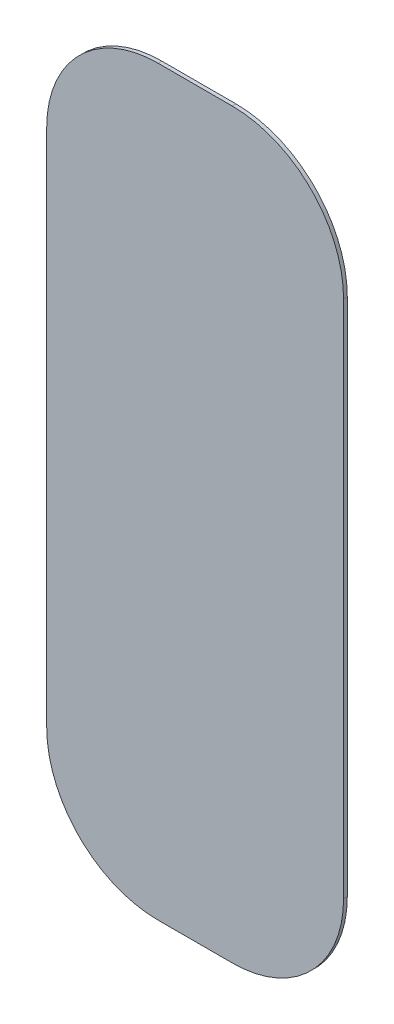
ISO-10303-21;
HEADER;
FILE_DESCRIPTION(('STEP AP214'),'2;1');
FILE_NAME('part.step','',(''),(''),'','','');
FILE_SCHEMA(('AUTOMOTIVE_DESIGN { 1 0 10303 214 1 1 1 1 }'));
ENDSEC;
DATA;
#1=APPLICATION_CONTEXT('core data for automotive mechanical design processes');
#2=APPLICATION_PROTOCOL_DEFINITION('international standard','automotive_design',2000,#1);
#3=PRODUCT_CONTEXT('',#1,'mechanical');
#4=PRODUCT('Part','Part','',(#3));
#5=PRODUCT_RELATED_PRODUCT_CATEGORY('part','',(#4));
#6=PRODUCT_DEFINITION_FORMATION('','',#4);
#7=PRODUCT_DEFINITION_CONTEXT('part definition',#1,'design');
#8=PRODUCT_DEFINITION('design','',#6,#7);
#9=PRODUCT_DEFINITION_SHAPE('','',#8);
#10=(LENGTH_UNIT() NAMED_UNIT(*) SI_UNIT(.MILLI.,.METRE.));
#11=(NAMED_UNIT(*) PLANE_ANGLE_UNIT() SI_UNIT($,.RADIAN.));
#12=(NAMED_UNIT(*) SI_UNIT($,.STERADIAN.) SOLID_ANGLE_UNIT());
#13=UNCERTAINTY_MEASURE_WITH_UNIT(LENGTH_MEASURE(1.E-05),#10,'distance_accuracy_value','');
#14=(GEOMETRIC_REPRESENTATION_CONTEXT(3) GLOBAL_UNCERTAINTY_ASSIGNED_CONTEXT((#13)) GLOBAL_UNIT_ASSIGNED_CONTEXT((#10,
#11,#12)) REPRESENTATION_CONTEXT('',''));
#15=CARTESIAN_POINT('',(0.,0.,0.));
#16=DIRECTION('',(0.,0.,1.));
#17=DIRECTION('',(1.,0.,0.));
#18=AXIS2_PLACEMENT_3D('',#15,#16,#17);
#19=CARTESIAN_POINT('',(-20.,140.,2.));
#20=DIRECTION('',(0.,0.,1.));
#21=DIRECTION('',(1.,0.,0.));
#22=AXIS2_PLACEMENT_3D('',#19,#20,#21);
#23=CYLINDRICAL_SURFACE('',#22,60.);
#24=DIRECTION('',(0.,0.,1.));
#25=VECTOR('',#24,1.);
#26=CARTESIAN_POINT('',(-20.,200.,2.));
#27=LINE('',#26,#25);
#28=CARTESIAN_POINT('',(-20.,200.,0.));
#29=VERTEX_POINT('',#28);
#30=CARTESIAN_POINT('',(-20.,200.,2.));
#31=VERTEX_POINT('',#30);
#32=EDGE_CURVE('E11',#29,#31,#27,.T.);
#33=ORIENTED_EDGE('',*,*,#32,.F.);
#34=CARTESIAN_POINT('',(-20.,140.,0.));
#35=DIRECTION('',(0.,0.,1.));
#36=DIRECTION('',(1.,0.,0.));
#37=AXIS2_PLACEMENT_3D('',#34,#35,#36);
#38=CIRCLE('',#37,60.);
#39=CARTESIAN_POINT('',(-80.,140.,0.));
#40=VERTEX_POINT('',#39);
#41=EDGE_CURVE('E104',#29,#40,#38,.T.);
#42=ORIENTED_EDGE('',*,*,#41,.T.);
#43=DIRECTION('',(0.,0.,1.));
#44=VECTOR('',#43,1.);
#45=CARTESIAN_POINT('',(-80.,140.,2.));
#46=LINE('',#45,#44);
#47=CARTESIAN_POINT('',(-80.,140.,2.));
#48=VERTEX_POINT('',#47);
#49=EDGE_CURVE('E47',#40,#48,#46,.T.);
#50=ORIENTED_EDGE('',*,*,#49,.T.);
#51=CARTESIAN_POINT('',(-20.,140.,2.));
#52=DIRECTION('',(0.,0.,1.));
#53=DIRECTION('',(-1.,0.,0.));
#54=AXIS2_PLACEMENT_3D('',#51,#52,#53);
#55=CIRCLE('',#54,60.);
#56=EDGE_CURVE('E143',#31,#48,#55,.T.);
#57=ORIENTED_EDGE('',*,*,#56,.F.);
#58=EDGE_LOOP('',(#33,#42,#50,#57));
#59=FACE_BOUND('',#58,.T.);
#60=ADVANCED_FACE('F37',(#59),#23,.T.);
#61=CARTESIAN_POINT('',(-79.9999999999999,-140.,2.));
#62=DIRECTION('',(-1.,0.,0.));
#63=DIRECTION('',(0.,-1.,0.));
#64=AXIS2_PLACEMENT_3D('',#61,#62,#63);
#65=PLANE('',#64);
#66=ORIENTED_EDGE('',*,*,#49,.F.);
#67=DIRECTION('',(0.,1.,0.));
#68=VECTOR('',#67,1.);
#69=CARTESIAN_POINT('',(-80.,140.,0.));
#70=LINE('',#69,#68);
#71=CARTESIAN_POINT('',(-79.9999999999999,-140.,0.));
#72=VERTEX_POINT('',#71);
#73=EDGE_CURVE('E123',#40,#72,#70,.F.);
#74=ORIENTED_EDGE('',*,*,#73,.T.);
#75=DIRECTION('',(0.,0.,1.));
#76=VECTOR('',#75,1.);
#77=CARTESIAN_POINT('',(-79.9999999999999,-140.,2.));
#78=LINE('',#77,#76);
#79=CARTESIAN_POINT('',(-79.9999999999999,-140.,2.));
#80=VERTEX_POINT('',#79);
#81=EDGE_CURVE('E136',#72,#80,#78,.T.);
#82=ORIENTED_EDGE('',*,*,#81,.T.);
#83=DIRECTION('',(0.,-1.,0.));
#84=VECTOR('',#83,1.);
#85=CARTESIAN_POINT('',(-79.9999999999999,-140.,2.));
#86=LINE('',#85,#84);
#87=EDGE_CURVE('E152',#48,#80,#86,.T.);
#88=ORIENTED_EDGE('',*,*,#87,.F.);
#89=EDGE_LOOP('',(#66,#74,#82,#88));
#90=FACE_BOUND('',#89,.T.);
#91=ADVANCED_FACE('F155',(#90),#65,.T.);
#92=CARTESIAN_POINT('',(-19.9999999999999,-140.,2.));
#93=DIRECTION('',(0.,0.,1.));
#94=DIRECTION('',(1.,0.,0.));
#95=AXIS2_PLACEMENT_3D('',#92,#93,#94);
#96=CYLINDRICAL_SURFACE('',#95,60.);
#97=ORIENTED_EDGE('',*,*,#81,.F.);
#98=CARTESIAN_POINT('',(-19.9999999999999,-140.,0.));
#99=DIRECTION('',(0.,0.,1.));
#100=DIRECTION('',(1.,0.,0.));
#101=AXIS2_PLACEMENT_3D('',#98,#99,#100);
#102=CIRCLE('',#101,60.);
#103=CARTESIAN_POINT('',(-19.9999999999999,-200.,0.));
#104=VERTEX_POINT('',#103);
#105=EDGE_CURVE('E120',#72,#104,#102,.T.);
#106=ORIENTED_EDGE('',*,*,#105,.T.);
#107=DIRECTION('',(0.,0.,1.));
#108=VECTOR('',#107,1.);
#109=CARTESIAN_POINT('',(-19.9999999999999,-200.,2.));
#110=LINE('',#109,#108);
#111=CARTESIAN_POINT('',(-19.9999999999999,-200.,2.));
#112=VERTEX_POINT('',#111);
#113=EDGE_CURVE('E133',#104,#112,#110,.T.);
#114=ORIENTED_EDGE('',*,*,#113,.T.);
#115=CARTESIAN_POINT('',(-19.9999999999999,-140.,2.));
#116=DIRECTION('',(0.,0.,1.));
#117=DIRECTION('',(1.,0.,0.));
#118=AXIS2_PLACEMENT_3D('',#115,#116,#117);
#119=CIRCLE('',#118,60.);
#120=EDGE_CURVE('E156',#80,#112,#119,.T.);
#121=ORIENTED_EDGE('',*,*,#120,.F.);
#122=EDGE_LOOP('',(#97,#106,#114,#121));
#123=FACE_BOUND('',#122,.T.);
#124=ADVANCED_FACE('F178',(#123),#96,.T.);
#125=CARTESIAN_POINT('',(20.,-200.,2.));
#126=DIRECTION('',(0.,-1.,0.));
#127=DIRECTION('',(1.,0.,0.));
#128=AXIS2_PLACEMENT_3D('',#125,#126,#127);
#129=PLANE('',#128);
#130=ORIENTED_EDGE('',*,*,#113,.F.);
#131=DIRECTION('',(1.,0.,0.));
#132=VECTOR('',#131,1.);
#133=CARTESIAN_POINT('',(20.,-200.,0.));
#134=LINE('',#133,#132);
#135=CARTESIAN_POINT('',(20.,-200.,0.));
#136=VERTEX_POINT('',#135);
#137=EDGE_CURVE('E117',#104,#136,#134,.T.);
#138=ORIENTED_EDGE('',*,*,#137,.T.);
#139=DIRECTION('',(0.,0.,1.));
#140=VECTOR('',#139,1.);
#141=CARTESIAN_POINT('',(20.,-200.,2.));
#142=LINE('',#141,#140);
#143=CARTESIAN_POINT('',(20.,-200.,2.));
#144=VERTEX_POINT('',#143);
#145=EDGE_CURVE('E130',#136,#144,#142,.T.);
#146=ORIENTED_EDGE('',*,*,#145,.T.);
#147=DIRECTION('',(1.,0.,0.));
#148=VECTOR('',#147,1.);
#149=CARTESIAN_POINT('',(20.,-200.,2.));
#150=LINE('',#149,#148);
#151=EDGE_CURVE('E158',#112,#144,#150,.T.);
#152=ORIENTED_EDGE('',*,*,#151,.F.);
#153=EDGE_LOOP('',(#130,#138,#146,#152));
#154=FACE_BOUND('',#153,.T.);
#155=ADVANCED_FACE('F174',(#154),#129,.T.);
#156=CARTESIAN_POINT('',(20.,-140.,2.));
#157=DIRECTION('',(0.,0.,1.));
#158=DIRECTION('',(1.,0.,0.));
#159=AXIS2_PLACEMENT_3D('',#156,#157,#158);
#160=CYLINDRICAL_SURFACE('',#159,60.);
#161=ORIENTED_EDGE('',*,*,#145,.F.);
#162=CARTESIAN_POINT('',(20.,-140.,0.));
#163=DIRECTION('',(0.,0.,1.));
#164=DIRECTION('',(1.,0.,0.));
#165=AXIS2_PLACEMENT_3D('',#162,#163,#164);
#166=CIRCLE('',#165,60.);
#167=CARTESIAN_POINT('',(80.,-140.,0.));
#168=VERTEX_POINT('',#167);
#169=EDGE_CURVE('E114',#136,#168,#166,.T.);
#170=ORIENTED_EDGE('',*,*,#169,.T.);
#171=DIRECTION('',(0.,0.,1.));
#172=VECTOR('',#171,1.);
#173=CARTESIAN_POINT('',(80.,-140.,2.));
#174=LINE('',#173,#172);
#175=CARTESIAN_POINT('',(80.,-140.,2.));
#176=VERTEX_POINT('',#175);
#177=EDGE_CURVE('E128',#168,#176,#174,.T.);
#178=ORIENTED_EDGE('',*,*,#177,.T.);
#179=CARTESIAN_POINT('',(20.,-140.,2.));
#180=DIRECTION('',(0.,0.,1.));
#181=DIRECTION('',(-1.,0.,0.));
#182=AXIS2_PLACEMENT_3D('',#179,#180,#181);
#183=CIRCLE('',#182,60.);
#184=EDGE_CURVE('E163',#144,#176,#183,.T.);
#185=ORIENTED_EDGE('',*,*,#184,.F.);
#186=EDGE_LOOP('',(#161,#170,#178,#185));
#187=FACE_BOUND('',#186,.T.);
#188=ADVANCED_FACE('F170',(#187),#160,.T.);
#189=CARTESIAN_POINT('',(80.,-140.,2.));
#190=DIRECTION('',(1.,0.,0.));
#191=DIRECTION('',(0.,1.,0.));
#192=AXIS2_PLACEMENT_3D('',#189,#190,#191);
#193=PLANE('',#192);
#194=ORIENTED_EDGE('',*,*,#177,.F.);
#195=DIRECTION('',(0.,1.,0.));
#196=VECTOR('',#195,1.);
#197=CARTESIAN_POINT('',(80.,140.,0.));
#198=LINE('',#197,#196);
#199=CARTESIAN_POINT('',(80.,140.,0.));
#200=VERTEX_POINT('',#199);
#201=EDGE_CURVE('E111',#168,#200,#198,.T.);
#202=ORIENTED_EDGE('',*,*,#201,.T.);
#203=DIRECTION('',(0.,0.,1.));
#204=VECTOR('',#203,1.);
#205=CARTESIAN_POINT('',(80.,140.,2.));
#206=LINE('',#205,#204);
#207=CARTESIAN_POINT('',(80.,140.,2.));
#208=VERTEX_POINT('',#207);
#209=EDGE_CURVE('E55',#200,#208,#206,.T.);
#210=ORIENTED_EDGE('',*,*,#209,.T.);
#211=DIRECTION('',(0.,1.,0.));
#212=VECTOR('',#211,1.);
#213=CARTESIAN_POINT('',(80.,-140.,2.));
#214=LINE('',#213,#212);
#215=EDGE_CURVE('E97',#176,#208,#214,.T.);
#216=ORIENTED_EDGE('',*,*,#215,.F.);
#217=EDGE_LOOP('',(#194,#202,#210,#216));
#218=FACE_BOUND('',#217,.T.);
#219=ADVANCED_FACE('F167',(#218),#193,.T.);
#220=CARTESIAN_POINT('',(20.,140.,2.));
#221=DIRECTION('',(0.,0.,1.));
#222=DIRECTION('',(1.,0.,0.));
#223=AXIS2_PLACEMENT_3D('',#220,#221,#222);
#224=CYLINDRICAL_SURFACE('',#223,60.);
#225=ORIENTED_EDGE('',*,*,#209,.F.);
#226=CARTESIAN_POINT('',(20.,140.,0.));
#227=DIRECTION('',(0.,0.,1.));
#228=DIRECTION('',(1.,0.,0.));
#229=AXIS2_PLACEMENT_3D('',#226,#227,#228);
#230=CIRCLE('',#229,60.);
#231=CARTESIAN_POINT('',(20.,200.,0.));
#232=VERTEX_POINT('',#231);
#233=EDGE_CURVE('E102',#200,#232,#230,.T.);
#234=ORIENTED_EDGE('',*,*,#233,.T.);
#235=DIRECTION('',(0.,0.,1.));
#236=VECTOR('',#235,1.);
#237=CARTESIAN_POINT('',(20.,200.,2.));
#238=LINE('',#237,#236);
#239=CARTESIAN_POINT('',(20.,200.,2.));
#240=VERTEX_POINT('',#239);
#241=EDGE_CURVE('E41',#232,#240,#238,.T.);
#242=ORIENTED_EDGE('',*,*,#241,.T.);
#243=CARTESIAN_POINT('',(20.,140.,2.));
#244=DIRECTION('',(0.,0.,1.));
#245=DIRECTION('',(1.,0.,0.));
#246=AXIS2_PLACEMENT_3D('',#243,#244,#245);
#247=CIRCLE('',#246,60.);
#248=EDGE_CURVE('E113',#208,#240,#247,.T.);
#249=ORIENTED_EDGE('',*,*,#248,.F.);
#250=EDGE_LOOP('',(#225,#234,#242,#249));
#251=FACE_BOUND('',#250,.T.);
#252=ADVANCED_FACE('F106',(#251),#224,.T.);
#253=CARTESIAN_POINT('',(20.,200.,2.));
#254=DIRECTION('',(0.,1.,0.));
#255=DIRECTION('',(-1.,0.,0.));
#256=AXIS2_PLACEMENT_3D('',#253,#254,#255);
#257=PLANE('',#256);
#258=DIRECTION('',(1.,0.,0.));
#259=VECTOR('',#258,1.);
#260=CARTESIAN_POINT('',(20.,200.,0.));
#261=LINE('',#260,#259);
#262=EDGE_CURVE('E91',#232,#29,#261,.F.);
#263=ORIENTED_EDGE('',*,*,#262,.T.);
#264=ORIENTED_EDGE('',*,*,#32,.T.);
#265=DIRECTION('',(-1.,0.,0.));
#266=VECTOR('',#265,1.);
#267=CARTESIAN_POINT('',(20.,200.,2.));
#268=LINE('',#267,#266);
#269=EDGE_CURVE('E93',#240,#31,#268,.T.);
#270=ORIENTED_EDGE('',*,*,#269,.F.);
#271=ORIENTED_EDGE('',*,*,#241,.F.);
#272=EDGE_LOOP('',(#263,#264,#270,#271));
#273=FACE_BOUND('',#272,.T.);
#274=ADVANCED_FACE('F39',(#273),#257,.T.);
#275=CARTESIAN_POINT('',(20.,140.,2.));
#276=DIRECTION('',(0.,0.,1.));
#277=DIRECTION('',(1.,0.,0.));
#278=AXIS2_PLACEMENT_3D('',#275,#276,#277);
#279=PLANE('',#278);
#280=ORIENTED_EDGE('',*,*,#248,.T.);
#281=ORIENTED_EDGE('',*,*,#269,.T.);
#282=ORIENTED_EDGE('',*,*,#56,.T.);
#283=ORIENTED_EDGE('',*,*,#87,.T.);
#284=ORIENTED_EDGE('',*,*,#120,.T.);
#285=ORIENTED_EDGE('',*,*,#151,.T.);
#286=ORIENTED_EDGE('',*,*,#184,.T.);
#287=ORIENTED_EDGE('',*,*,#215,.T.);
#288=EDGE_LOOP('',(#280,#281,#282,#283,#284,#285,#286,#287));
#289=FACE_BOUND('',#288,.T.);
#290=ADVANCED_FACE('F150',(#289),#279,.T.);
#291=CARTESIAN_POINT('',(20.,140.,0.));
#292=DIRECTION('',(0.,0.,1.));
#293=DIRECTION('',(1.,0.,0.));
#294=AXIS2_PLACEMENT_3D('',#291,#292,#293);
#295=PLANE('',#294);
#296=ORIENTED_EDGE('',*,*,#233,.F.);
#297=ORIENTED_EDGE('',*,*,#201,.F.);
#298=ORIENTED_EDGE('',*,*,#169,.F.);
#299=ORIENTED_EDGE('',*,*,#137,.F.);
#300=ORIENTED_EDGE('',*,*,#105,.F.);
#301=ORIENTED_EDGE('',*,*,#73,.F.);
#302=ORIENTED_EDGE('',*,*,#41,.F.);
#303=ORIENTED_EDGE('',*,*,#262,.F.);
#304=EDGE_LOOP('',(#296,#297,#298,#299,#300,#301,#302,#303));
#305=FACE_BOUND('',#304,.T.);
#306=ADVANCED_FACE('F100',(#305),#295,.F.);
#307=CLOSED_SHELL('',(#60,#91,#124,#155,#188,#219,#252,#274,#290,#306));
#308=MANIFOLD_SOLID_BREP('B2',#307);
#309=ADVANCED_BREP_SHAPE_REPRESENTATION('',(#18,#308),#14);
#310=SHAPE_DEFINITION_REPRESENTATION(#9,#309);
ENDSEC;
END-ISO-10303-21;
